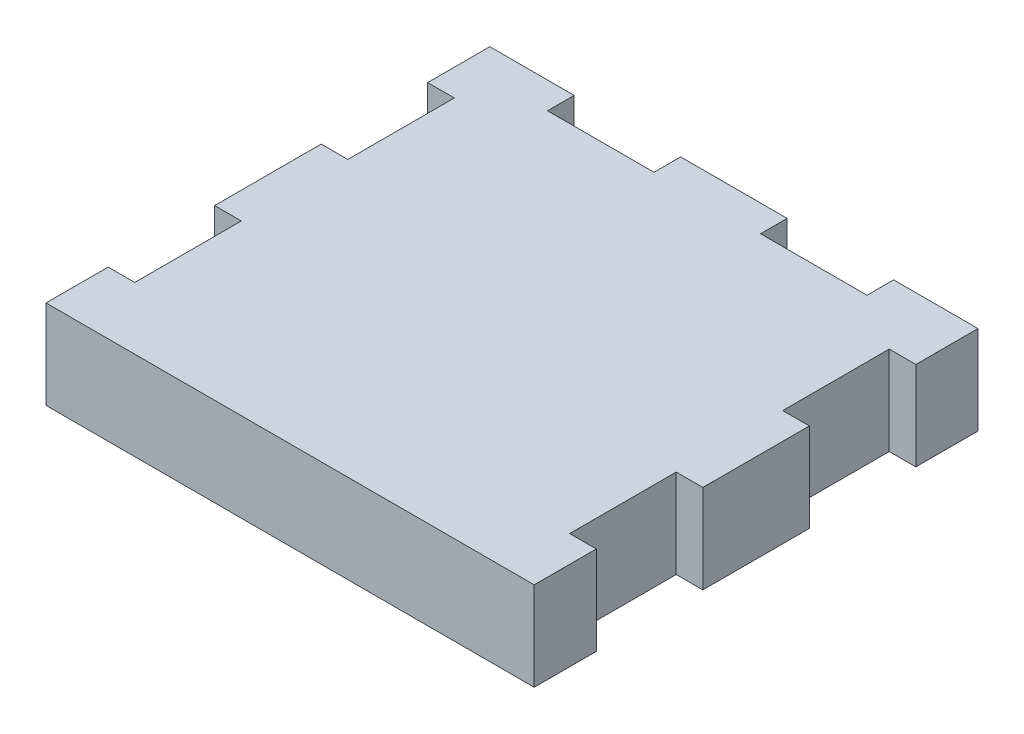
ISO-10303-21;
HEADER;
FILE_DESCRIPTION(('STEP AP214'),'2;1');
FILE_NAME('part.step','',(''),(''),'','','');
FILE_SCHEMA(('AUTOMOTIVE_DESIGN { 1 0 10303 214 1 1 1 1 }'));
ENDSEC;
DATA;
#1=APPLICATION_CONTEXT('core data for automotive mechanical design processes');
#2=APPLICATION_PROTOCOL_DEFINITION('international standard','automotive_design',2000,#1);
#3=PRODUCT_CONTEXT('',#1,'mechanical');
#4=PRODUCT('Part','Part','',(#3));
#5=PRODUCT_RELATED_PRODUCT_CATEGORY('part','',(#4));
#6=PRODUCT_DEFINITION_FORMATION('','',#4);
#7=PRODUCT_DEFINITION_CONTEXT('part definition',#1,'design');
#8=PRODUCT_DEFINITION('design','',#6,#7);
#9=PRODUCT_DEFINITION_SHAPE('','',#8);
#10=(LENGTH_UNIT() NAMED_UNIT(*) SI_UNIT(.MILLI.,.METRE.));
#11=(NAMED_UNIT(*) PLANE_ANGLE_UNIT() SI_UNIT($,.RADIAN.));
#12=(NAMED_UNIT(*) SI_UNIT($,.STERADIAN.) SOLID_ANGLE_UNIT());
#13=UNCERTAINTY_MEASURE_WITH_UNIT(LENGTH_MEASURE(1.E-05),#10,'distance_accuracy_value','');
#14=(GEOMETRIC_REPRESENTATION_CONTEXT(3) GLOBAL_UNCERTAINTY_ASSIGNED_CONTEXT((#13)) GLOBAL_UNIT_ASSIGNED_CONTEXT((#10,
#11,#12)) REPRESENTATION_CONTEXT('',''));
#15=CARTESIAN_POINT('',(0.,0.,0.));
#16=DIRECTION('',(0.,0.,1.));
#17=DIRECTION('',(1.,0.,0.));
#18=AXIS2_PLACEMENT_3D('',#15,#16,#17);
#19=CARTESIAN_POINT('',(-135.812908411026,10.,-122.703686356544));
#20=DIRECTION('',(1.,0.,0.));
#21=DIRECTION('',(0.,0.,-1.));
#22=AXIS2_PLACEMENT_3D('',#19,#20,#21);
#23=PLANE('',#22);
#24=DIRECTION('',(0.,0.,1.));
#25=VECTOR('',#24,1.);
#26=CARTESIAN_POINT('',(-135.812908411026,0.,-122.703686356544));
#27=LINE('',#26,#25);
#28=CARTESIAN_POINT('',(-135.812908411026,0.,-125.703692436218));
#29=VERTEX_POINT('',#28);
#30=CARTESIAN_POINT('',(-135.812908411026,0.,-118.703693151474));
#31=VERTEX_POINT('',#30);
#32=EDGE_CURVE('E153',#29,#31,#27,.T.);
#33=ORIENTED_EDGE('',*,*,#32,.T.);
#34=DIRECTION('',(0.,-1.,0.));
#35=VECTOR('',#34,1.);
#36=CARTESIAN_POINT('',(-135.812908411026,10.,-118.703693151474));
#37=LINE('',#36,#35);
#38=CARTESIAN_POINT('',(-135.812908411026,10.,-118.703693151474));
#39=VERTEX_POINT('',#38);
#40=EDGE_CURVE('E11',#39,#31,#37,.T.);
#41=ORIENTED_EDGE('',*,*,#40,.F.);
#42=DIRECTION('',(0.,0.,1.));
#43=VECTOR('',#42,1.);
#44=CARTESIAN_POINT('',(-135.812908411026,10.,-125.703692436218));
#45=LINE('',#44,#43);
#46=CARTESIAN_POINT('',(-135.812908411026,10.,-125.703692436218));
#47=VERTEX_POINT('',#46);
#48=EDGE_CURVE('E159',#47,#39,#45,.T.);
#49=ORIENTED_EDGE('',*,*,#48,.F.);
#50=DIRECTION('',(0.,-1.,0.));
#51=VECTOR('',#50,1.);
#52=CARTESIAN_POINT('',(-135.812908411026,10.,-125.703692436218));
#53=LINE('',#52,#51);
#54=EDGE_CURVE('E253',#47,#29,#53,.T.);
#55=ORIENTED_EDGE('',*,*,#54,.T.);
#56=EDGE_LOOP('',(#33,#41,#49,#55));
#57=FACE_BOUND('',#56,.T.);
#58=ADVANCED_FACE('F41',(#57),#23,.F.);
#59=CARTESIAN_POINT('',(-135.812908411026,10.,-118.703693151474));
#60=DIRECTION('',(0.,0.,-1.));
#61=DIRECTION('',(-1.,0.,0.));
#62=AXIS2_PLACEMENT_3D('',#59,#60,#61);
#63=PLANE('',#62);
#64=DIRECTION('',(1.,0.,0.));
#65=VECTOR('',#64,1.);
#66=CARTESIAN_POINT('',(-135.812908411026,0.,-118.703693151474));
#67=LINE('',#66,#65);
#68=CARTESIAN_POINT('',(-132.812917232513,0.,-118.703693151474));
#69=VERTEX_POINT('',#68);
#70=EDGE_CURVE('E258',#31,#69,#67,.T.);
#71=ORIENTED_EDGE('',*,*,#70,.T.);
#72=DIRECTION('',(0.,-1.,0.));
#73=VECTOR('',#72,1.);
#74=CARTESIAN_POINT('',(-132.812917232513,10.,-118.703693151474));
#75=LINE('',#74,#73);
#76=CARTESIAN_POINT('',(-132.812917232513,10.,-118.703693151474));
#77=VERTEX_POINT('',#76);
#78=EDGE_CURVE('E49',#77,#69,#75,.T.);
#79=ORIENTED_EDGE('',*,*,#78,.F.);
#80=DIRECTION('',(1.,0.,0.));
#81=VECTOR('',#80,1.);
#82=CARTESIAN_POINT('',(-135.812908411026,10.,-118.703693151474));
#83=LINE('',#82,#81);
#84=EDGE_CURVE('E459',#39,#77,#83,.T.);
#85=ORIENTED_EDGE('',*,*,#84,.F.);
#86=ORIENTED_EDGE('',*,*,#40,.T.);
#87=EDGE_LOOP('',(#71,#79,#85,#86));
#88=FACE_BOUND('',#87,.T.);
#89=ADVANCED_FACE('F462',(#88),#63,.F.);
#90=CARTESIAN_POINT('',(-132.812917232513,10.,-118.703693151474));
#91=DIRECTION('',(1.,0.,0.));
#92=DIRECTION('',(0.,0.,-1.));
#93=AXIS2_PLACEMENT_3D('',#90,#91,#92);
#94=PLANE('',#93);
#95=DIRECTION('',(0.,0.,1.));
#96=VECTOR('',#95,1.);
#97=CARTESIAN_POINT('',(-132.812917232513,0.,-118.703693151474));
#98=LINE('',#97,#96);
#99=CARTESIAN_POINT('',(-132.812917232513,0.,-106.703691184521));
#100=VERTEX_POINT('',#99);
#101=EDGE_CURVE('E260',#69,#100,#98,.T.);
#102=ORIENTED_EDGE('',*,*,#101,.T.);
#103=DIRECTION('',(0.,-1.,0.));
#104=VECTOR('',#103,1.);
#105=CARTESIAN_POINT('',(-132.812917232513,10.,-106.703691184521));
#106=LINE('',#105,#104);
#107=CARTESIAN_POINT('',(-132.812917232513,10.,-106.703691184521));
#108=VERTEX_POINT('',#107);
#109=EDGE_CURVE('E378',#108,#100,#106,.T.);
#110=ORIENTED_EDGE('',*,*,#109,.F.);
#111=DIRECTION('',(0.,0.,1.));
#112=VECTOR('',#111,1.);
#113=CARTESIAN_POINT('',(-132.812917232513,10.,-118.703693151474));
#114=LINE('',#113,#112);
#115=EDGE_CURVE('E387',#77,#108,#114,.T.);
#116=ORIENTED_EDGE('',*,*,#115,.F.);
#117=ORIENTED_EDGE('',*,*,#78,.T.);
#118=EDGE_LOOP('',(#102,#110,#116,#117));
#119=FACE_BOUND('',#118,.T.);
#120=ADVANCED_FACE('F385',(#119),#94,.F.);
#121=CARTESIAN_POINT('',(-135.812908411026,10.,-106.703691184521));
#122=DIRECTION('',(0.,0.,1.));
#123=DIRECTION('',(1.,0.,0.));
#124=AXIS2_PLACEMENT_3D('',#121,#122,#123);
#125=PLANE('',#124);
#126=DIRECTION('',(-1.,0.,0.));
#127=VECTOR('',#126,1.);
#128=CARTESIAN_POINT('',(-135.812908411026,0.,-106.703691184521));
#129=LINE('',#128,#127);
#130=CARTESIAN_POINT('',(-135.812908411026,0.,-106.703691184521));
#131=VERTEX_POINT('',#130);
#132=EDGE_CURVE('E262',#100,#131,#129,.T.);
#133=ORIENTED_EDGE('',*,*,#132,.T.);
#134=DIRECTION('',(0.,-1.,0.));
#135=VECTOR('',#134,1.);
#136=CARTESIAN_POINT('',(-135.812908411026,10.,-106.703691184521));
#137=LINE('',#136,#135);
#138=CARTESIAN_POINT('',(-135.812908411026,10.,-106.703691184521));
#139=VERTEX_POINT('',#138);
#140=EDGE_CURVE('E375',#139,#131,#137,.T.);
#141=ORIENTED_EDGE('',*,*,#140,.F.);
#142=DIRECTION('',(-1.,0.,0.));
#143=VECTOR('',#142,1.);
#144=CARTESIAN_POINT('',(-135.812908411026,10.,-106.703691184521));
#145=LINE('',#144,#143);
#146=EDGE_CURVE('E405',#108,#139,#145,.T.);
#147=ORIENTED_EDGE('',*,*,#146,.F.);
#148=ORIENTED_EDGE('',*,*,#109,.T.);
#149=EDGE_LOOP('',(#133,#141,#147,#148));
#150=FACE_BOUND('',#149,.T.);
#151=ADVANCED_FACE('F396',(#150),#125,.F.);
#152=CARTESIAN_POINT('',(-135.812908411026,10.,-106.703691184521));
#153=DIRECTION('',(1.,0.,0.));
#154=DIRECTION('',(0.,0.,-1.));
#155=AXIS2_PLACEMENT_3D('',#152,#153,#154);
#156=PLANE('',#155);
#157=DIRECTION('',(0.,0.,1.));
#158=VECTOR('',#157,1.);
#159=CARTESIAN_POINT('',(-135.812908411026,0.,-106.703691184521));
#160=LINE('',#159,#158);
#161=CARTESIAN_POINT('',(-135.812908411026,0.,-94.7036892175674));
#162=VERTEX_POINT('',#161);
#163=EDGE_CURVE('E264',#131,#162,#160,.T.);
#164=ORIENTED_EDGE('',*,*,#163,.T.);
#165=DIRECTION('',(0.,-1.,0.));
#166=VECTOR('',#165,1.);
#167=CARTESIAN_POINT('',(-135.812908411026,10.,-94.7036892175674));
#168=LINE('',#167,#166);
#169=CARTESIAN_POINT('',(-135.812908411026,10.,-94.7036892175674));
#170=VERTEX_POINT('',#169);
#171=EDGE_CURVE('E372',#170,#162,#168,.T.);
#172=ORIENTED_EDGE('',*,*,#171,.F.);
#173=DIRECTION('',(0.,0.,1.));
#174=VECTOR('',#173,1.);
#175=CARTESIAN_POINT('',(-135.812908411026,10.,-106.703691184521));
#176=LINE('',#175,#174);
#177=EDGE_CURVE('E402',#139,#170,#176,.T.);
#178=ORIENTED_EDGE('',*,*,#177,.F.);
#179=ORIENTED_EDGE('',*,*,#140,.T.);
#180=EDGE_LOOP('',(#164,#172,#178,#179));
#181=FACE_BOUND('',#180,.T.);
#182=ADVANCED_FACE('F400',(#181),#156,.F.);
#183=CARTESIAN_POINT('',(-135.812908411026,10.,-94.7036892175674));
#184=DIRECTION('',(0.,0.,-1.));
#185=DIRECTION('',(-1.,0.,0.));
#186=AXIS2_PLACEMENT_3D('',#183,#184,#185);
#187=PLANE('',#186);
#188=DIRECTION('',(1.,0.,0.));
#189=VECTOR('',#188,1.);
#190=CARTESIAN_POINT('',(-135.812908411026,0.,-94.7036892175674));
#191=LINE('',#190,#189);
#192=CARTESIAN_POINT('',(-132.812917232513,0.,-94.7036892175674));
#193=VERTEX_POINT('',#192);
#194=EDGE_CURVE('E266',#162,#193,#191,.T.);
#195=ORIENTED_EDGE('',*,*,#194,.T.);
#196=DIRECTION('',(0.,-1.,0.));
#197=VECTOR('',#196,1.);
#198=CARTESIAN_POINT('',(-132.812917232513,10.,-94.7036892175674));
#199=LINE('',#198,#197);
#200=CARTESIAN_POINT('',(-132.812917232513,10.,-94.7036892175674));
#201=VERTEX_POINT('',#200);
#202=EDGE_CURVE('E369',#201,#193,#199,.T.);
#203=ORIENTED_EDGE('',*,*,#202,.F.);
#204=DIRECTION('',(1.,0.,0.));
#205=VECTOR('',#204,1.);
#206=CARTESIAN_POINT('',(-135.812908411026,10.,-94.7036892175674));
#207=LINE('',#206,#205);
#208=EDGE_CURVE('E404',#170,#201,#207,.T.);
#209=ORIENTED_EDGE('',*,*,#208,.F.);
#210=ORIENTED_EDGE('',*,*,#171,.T.);
#211=EDGE_LOOP('',(#195,#203,#209,#210));
#212=FACE_BOUND('',#211,.T.);
#213=ADVANCED_FACE('F474',(#212),#187,.F.);
#214=CARTESIAN_POINT('',(-132.812917232513,10.,-94.7036892175674));
#215=DIRECTION('',(1.,0.,0.));
#216=DIRECTION('',(0.,0.,-1.));
#217=AXIS2_PLACEMENT_3D('',#214,#215,#216);
#218=PLANE('',#217);
#219=DIRECTION('',(0.,0.,1.));
#220=VECTOR('',#219,1.);
#221=CARTESIAN_POINT('',(-132.812917232513,0.,-94.7036892175674));
#222=LINE('',#221,#220);
#223=CARTESIAN_POINT('',(-132.812917232513,0.,-82.7036872506142));
#224=VERTEX_POINT('',#223);
#225=EDGE_CURVE('E268',#193,#224,#222,.T.);
#226=ORIENTED_EDGE('',*,*,#225,.T.);
#227=DIRECTION('',(0.,-1.,0.));
#228=VECTOR('',#227,1.);
#229=CARTESIAN_POINT('',(-132.812917232513,10.,-82.7036872506142));
#230=LINE('',#229,#228);
#231=CARTESIAN_POINT('',(-132.812917232513,10.,-82.7036872506142));
#232=VERTEX_POINT('',#231);
#233=EDGE_CURVE('E366',#232,#224,#230,.T.);
#234=ORIENTED_EDGE('',*,*,#233,.F.);
#235=DIRECTION('',(0.,0.,1.));
#236=VECTOR('',#235,1.);
#237=CARTESIAN_POINT('',(-132.812917232513,10.,-94.7036892175674));
#238=LINE('',#237,#236);
#239=EDGE_CURVE('E407',#201,#232,#238,.T.);
#240=ORIENTED_EDGE('',*,*,#239,.F.);
#241=ORIENTED_EDGE('',*,*,#202,.T.);
#242=EDGE_LOOP('',(#226,#234,#240,#241));
#243=FACE_BOUND('',#242,.T.);
#244=ADVANCED_FACE('F477',(#243),#218,.F.);
#245=CARTESIAN_POINT('',(-135.812908411026,10.,-82.7036872506142));
#246=DIRECTION('',(0.,0.,1.));
#247=DIRECTION('',(1.,0.,0.));
#248=AXIS2_PLACEMENT_3D('',#245,#246,#247);
#249=PLANE('',#248);
#250=DIRECTION('',(-1.,0.,0.));
#251=VECTOR('',#250,1.);
#252=CARTESIAN_POINT('',(-135.812908411026,0.,-82.7036872506142));
#253=LINE('',#252,#251);
#254=CARTESIAN_POINT('',(-135.812908411026,0.,-82.7036872506142));
#255=VERTEX_POINT('',#254);
#256=EDGE_CURVE('E270',#224,#255,#253,.T.);
#257=ORIENTED_EDGE('',*,*,#256,.T.);
#258=DIRECTION('',(0.,-1.,0.));
#259=VECTOR('',#258,1.);
#260=CARTESIAN_POINT('',(-135.812908411026,10.,-82.7036872506142));
#261=LINE('',#260,#259);
#262=CARTESIAN_POINT('',(-135.812908411026,10.,-82.7036872506142));
#263=VERTEX_POINT('',#262);
#264=EDGE_CURVE('E363',#263,#255,#261,.T.);
#265=ORIENTED_EDGE('',*,*,#264,.F.);
#266=DIRECTION('',(-1.,0.,0.));
#267=VECTOR('',#266,1.);
#268=CARTESIAN_POINT('',(-135.812908411026,10.,-82.7036872506142));
#269=LINE('',#268,#267);
#270=EDGE_CURVE('E413',#232,#263,#269,.T.);
#271=ORIENTED_EDGE('',*,*,#270,.F.);
#272=ORIENTED_EDGE('',*,*,#233,.T.);
#273=EDGE_LOOP('',(#257,#265,#271,#272));
#274=FACE_BOUND('',#273,.T.);
#275=ADVANCED_FACE('F481',(#274),#249,.F.);
#276=CARTESIAN_POINT('',(-135.812908411026,10.,-82.7036872506142));
#277=DIRECTION('',(1.,0.,0.));
#278=DIRECTION('',(0.,0.,-1.));
#279=AXIS2_PLACEMENT_3D('',#276,#277,#278);
#280=PLANE('',#279);
#281=DIRECTION('',(0.,0.,1.));
#282=VECTOR('',#281,1.);
#283=CARTESIAN_POINT('',(-135.812908411026,0.,-82.7036872506142));
#284=LINE('',#283,#282);
#285=CARTESIAN_POINT('',(-135.812908411026,0.,-75.7036879658699));
#286=VERTEX_POINT('',#285);
#287=EDGE_CURVE('E272',#255,#286,#284,.T.);
#288=ORIENTED_EDGE('',*,*,#287,.T.);
#289=DIRECTION('',(0.,-1.,0.));
#290=VECTOR('',#289,1.);
#291=CARTESIAN_POINT('',(-135.812908411026,10.,-75.7036879658699));
#292=LINE('',#291,#290);
#293=CARTESIAN_POINT('',(-135.812908411026,10.,-75.7036879658699));
#294=VERTEX_POINT('',#293);
#295=EDGE_CURVE('E360',#294,#286,#292,.T.);
#296=ORIENTED_EDGE('',*,*,#295,.F.);
#297=DIRECTION('',(0.,0.,1.));
#298=VECTOR('',#297,1.);
#299=CARTESIAN_POINT('',(-135.812908411026,10.,-82.7036872506142));
#300=LINE('',#299,#298);
#301=EDGE_CURVE('E415',#263,#294,#300,.T.);
#302=ORIENTED_EDGE('',*,*,#301,.F.);
#303=ORIENTED_EDGE('',*,*,#264,.T.);
#304=EDGE_LOOP('',(#288,#296,#302,#303));
#305=FACE_BOUND('',#304,.T.);
#306=ADVANCED_FACE('F485',(#305),#280,.F.);
#307=CARTESIAN_POINT('',(-135.812908411026,10.,-75.7036879658699));
#308=DIRECTION('',(0.,0.,-1.));
#309=DIRECTION('',(-1.,0.,0.));
#310=AXIS2_PLACEMENT_3D('',#307,#308,#309);
#311=PLANE('',#310);
#312=DIRECTION('',(1.,0.,0.));
#313=VECTOR('',#312,1.);
#314=CARTESIAN_POINT('',(-135.812908411026,0.,-75.7036879658699));
#315=LINE('',#314,#313);
#316=CARTESIAN_POINT('',(-80.8129087090492,0.,-75.7036879658699));
#317=VERTEX_POINT('',#316);
#318=EDGE_CURVE('E274',#286,#317,#315,.T.);
#319=ORIENTED_EDGE('',*,*,#318,.T.);
#320=DIRECTION('',(0.,-1.,0.));
#321=VECTOR('',#320,1.);
#322=CARTESIAN_POINT('',(-80.8129087090492,10.,-75.7036879658699));
#323=LINE('',#322,#321);
#324=CARTESIAN_POINT('',(-80.8129087090492,10.,-75.7036879658699));
#325=VERTEX_POINT('',#324);
#326=EDGE_CURVE('E357',#325,#317,#323,.T.);
#327=ORIENTED_EDGE('',*,*,#326,.F.);
#328=DIRECTION('',(1.,0.,0.));
#329=VECTOR('',#328,1.);
#330=CARTESIAN_POINT('',(-135.812908411026,10.,-75.7036879658699));
#331=LINE('',#330,#329);
#332=EDGE_CURVE('E417',#294,#325,#331,.T.);
#333=ORIENTED_EDGE('',*,*,#332,.F.);
#334=ORIENTED_EDGE('',*,*,#295,.T.);
#335=EDGE_LOOP('',(#319,#327,#333,#334));
#336=FACE_BOUND('',#335,.T.);
#337=ADVANCED_FACE('F489',(#336),#311,.F.);
#338=CARTESIAN_POINT('',(-80.8129087090492,10.,-82.7036872506142));
#339=DIRECTION('',(-1.,0.,0.));
#340=DIRECTION('',(0.,0.,1.));
#341=AXIS2_PLACEMENT_3D('',#338,#339,#340);
#342=PLANE('',#341);
#343=DIRECTION('',(0.,0.,-1.));
#344=VECTOR('',#343,1.);
#345=CARTESIAN_POINT('',(-80.8129087090492,0.,-82.7036872506142));
#346=LINE('',#345,#344);
#347=CARTESIAN_POINT('',(-80.8129087090492,0.,-82.7036872506142));
#348=VERTEX_POINT('',#347);
#349=EDGE_CURVE('E276',#317,#348,#346,.T.);
#350=ORIENTED_EDGE('',*,*,#349,.T.);
#351=DIRECTION('',(0.,-1.,0.));
#352=VECTOR('',#351,1.);
#353=CARTESIAN_POINT('',(-80.8129087090492,10.,-82.7036872506142));
#354=LINE('',#353,#352);
#355=CARTESIAN_POINT('',(-80.8129087090492,10.,-82.7036872506142));
#356=VERTEX_POINT('',#355);
#357=EDGE_CURVE('E354',#356,#348,#354,.T.);
#358=ORIENTED_EDGE('',*,*,#357,.F.);
#359=DIRECTION('',(0.,0.,-1.));
#360=VECTOR('',#359,1.);
#361=CARTESIAN_POINT('',(-80.8129087090492,10.,-82.7036872506142));
#362=LINE('',#361,#360);
#363=EDGE_CURVE('E419',#325,#356,#362,.T.);
#364=ORIENTED_EDGE('',*,*,#363,.F.);
#365=ORIENTED_EDGE('',*,*,#326,.T.);
#366=EDGE_LOOP('',(#350,#358,#364,#365));
#367=FACE_BOUND('',#366,.T.);
#368=ADVANCED_FACE('F493',(#367),#342,.F.);
#369=CARTESIAN_POINT('',(-83.812914788723,10.,-82.7036872506142));
#370=DIRECTION('',(0.,0.,1.));
#371=DIRECTION('',(1.,0.,0.));
#372=AXIS2_PLACEMENT_3D('',#369,#370,#371);
#373=PLANE('',#372);
#374=DIRECTION('',(-1.,0.,0.));
#375=VECTOR('',#374,1.);
#376=CARTESIAN_POINT('',(-83.812914788723,0.,-82.7036872506142));
#377=LINE('',#376,#375);
#378=CARTESIAN_POINT('',(-83.812914788723,0.,-82.7036872506142));
#379=VERTEX_POINT('',#378);
#380=EDGE_CURVE('E278',#348,#379,#377,.T.);
#381=ORIENTED_EDGE('',*,*,#380,.T.);
#382=DIRECTION('',(0.,-1.,0.));
#383=VECTOR('',#382,1.);
#384=CARTESIAN_POINT('',(-83.812914788723,10.,-82.7036872506142));
#385=LINE('',#384,#383);
#386=CARTESIAN_POINT('',(-83.812914788723,10.,-82.7036872506142));
#387=VERTEX_POINT('',#386);
#388=EDGE_CURVE('E351',#387,#379,#385,.T.);
#389=ORIENTED_EDGE('',*,*,#388,.F.);
#390=DIRECTION('',(-1.,0.,0.));
#391=VECTOR('',#390,1.);
#392=CARTESIAN_POINT('',(-83.812914788723,10.,-82.7036872506142));
#393=LINE('',#392,#391);
#394=EDGE_CURVE('E421',#356,#387,#393,.T.);
#395=ORIENTED_EDGE('',*,*,#394,.F.);
#396=ORIENTED_EDGE('',*,*,#357,.T.);
#397=EDGE_LOOP('',(#381,#389,#395,#396));
#398=FACE_BOUND('',#397,.T.);
#399=ADVANCED_FACE('F497',(#398),#373,.F.);
#400=CARTESIAN_POINT('',(-83.812914788723,10.,-94.7036892175674));
#401=DIRECTION('',(-1.,0.,0.));
#402=DIRECTION('',(0.,0.,1.));
#403=AXIS2_PLACEMENT_3D('',#400,#401,#402);
#404=PLANE('',#403);
#405=DIRECTION('',(0.,0.,-1.));
#406=VECTOR('',#405,1.);
#407=CARTESIAN_POINT('',(-83.812914788723,0.,-94.7036892175674));
#408=LINE('',#407,#406);
#409=CARTESIAN_POINT('',(-83.812914788723,0.,-94.7036892175674));
#410=VERTEX_POINT('',#409);
#411=EDGE_CURVE('E280',#379,#410,#408,.T.);
#412=ORIENTED_EDGE('',*,*,#411,.T.);
#413=DIRECTION('',(0.,-1.,0.));
#414=VECTOR('',#413,1.);
#415=CARTESIAN_POINT('',(-83.812914788723,10.,-94.7036892175674));
#416=LINE('',#415,#414);
#417=CARTESIAN_POINT('',(-83.812914788723,10.,-94.7036892175674));
#418=VERTEX_POINT('',#417);
#419=EDGE_CURVE('E348',#418,#410,#416,.T.);
#420=ORIENTED_EDGE('',*,*,#419,.F.);
#421=DIRECTION('',(0.,0.,-1.));
#422=VECTOR('',#421,1.);
#423=CARTESIAN_POINT('',(-83.812914788723,10.,-94.7036892175674));
#424=LINE('',#423,#422);
#425=EDGE_CURVE('E423',#387,#418,#424,.T.);
#426=ORIENTED_EDGE('',*,*,#425,.F.);
#427=ORIENTED_EDGE('',*,*,#388,.T.);
#428=EDGE_LOOP('',(#412,#420,#426,#427));
#429=FACE_BOUND('',#428,.T.);
#430=ADVANCED_FACE('F501',(#429),#404,.F.);
#431=CARTESIAN_POINT('',(-83.812914788723,10.,-94.7036892175674));
#432=DIRECTION('',(0.,0.,-1.));
#433=DIRECTION('',(-1.,0.,0.));
#434=AXIS2_PLACEMENT_3D('',#431,#432,#433);
#435=PLANE('',#434);
#436=DIRECTION('',(1.,0.,0.));
#437=VECTOR('',#436,1.);
#438=CARTESIAN_POINT('',(-83.812914788723,0.,-94.7036892175674));
#439=LINE('',#438,#437);
#440=CARTESIAN_POINT('',(-80.8129087090492,0.,-94.7036892175674));
#441=VERTEX_POINT('',#440);
#442=EDGE_CURVE('E282',#410,#441,#439,.T.);
#443=ORIENTED_EDGE('',*,*,#442,.T.);
#444=DIRECTION('',(0.,-1.,0.));
#445=VECTOR('',#444,1.);
#446=CARTESIAN_POINT('',(-80.8129087090492,10.,-94.7036892175674));
#447=LINE('',#446,#445);
#448=CARTESIAN_POINT('',(-80.8129087090492,10.,-94.7036892175674));
#449=VERTEX_POINT('',#448);
#450=EDGE_CURVE('E345',#449,#441,#447,.T.);
#451=ORIENTED_EDGE('',*,*,#450,.F.);
#452=DIRECTION('',(1.,0.,0.));
#453=VECTOR('',#452,1.);
#454=CARTESIAN_POINT('',(-83.812914788723,10.,-94.7036892175674));
#455=LINE('',#454,#453);
#456=EDGE_CURVE('E425',#418,#449,#455,.T.);
#457=ORIENTED_EDGE('',*,*,#456,.F.);
#458=ORIENTED_EDGE('',*,*,#419,.T.);
#459=EDGE_LOOP('',(#443,#451,#457,#458));
#460=FACE_BOUND('',#459,.T.);
#461=ADVANCED_FACE('F505',(#460),#435,.F.);
#462=CARTESIAN_POINT('',(-80.8129087090492,10.,-106.703691184521));
#463=DIRECTION('',(-1.,0.,0.));
#464=DIRECTION('',(0.,0.,1.));
#465=AXIS2_PLACEMENT_3D('',#462,#463,#464);
#466=PLANE('',#465);
#467=DIRECTION('',(0.,0.,-1.));
#468=VECTOR('',#467,1.);
#469=CARTESIAN_POINT('',(-80.8129087090492,0.,-106.703691184521));
#470=LINE('',#469,#468);
#471=CARTESIAN_POINT('',(-80.8129087090492,0.,-106.703691184521));
#472=VERTEX_POINT('',#471);
#473=EDGE_CURVE('E284',#441,#472,#470,.T.);
#474=ORIENTED_EDGE('',*,*,#473,.T.);
#475=DIRECTION('',(0.,-1.,0.));
#476=VECTOR('',#475,1.);
#477=CARTESIAN_POINT('',(-80.8129087090492,10.,-106.703691184521));
#478=LINE('',#477,#476);
#479=CARTESIAN_POINT('',(-80.8129087090492,10.,-106.703691184521));
#480=VERTEX_POINT('',#479);
#481=EDGE_CURVE('E342',#480,#472,#478,.T.);
#482=ORIENTED_EDGE('',*,*,#481,.F.);
#483=DIRECTION('',(0.,0.,-1.));
#484=VECTOR('',#483,1.);
#485=CARTESIAN_POINT('',(-80.8129087090492,10.,-106.703691184521));
#486=LINE('',#485,#484);
#487=EDGE_CURVE('E427',#449,#480,#486,.T.);
#488=ORIENTED_EDGE('',*,*,#487,.F.);
#489=ORIENTED_EDGE('',*,*,#450,.T.);
#490=EDGE_LOOP('',(#474,#482,#488,#489));
#491=FACE_BOUND('',#490,.T.);
#492=ADVANCED_FACE('F509',(#491),#466,.F.);
#493=CARTESIAN_POINT('',(-83.812914788723,10.,-106.703691184521));
#494=DIRECTION('',(0.,0.,1.));
#495=DIRECTION('',(1.,0.,0.));
#496=AXIS2_PLACEMENT_3D('',#493,#494,#495);
#497=PLANE('',#496);
#498=DIRECTION('',(-1.,0.,0.));
#499=VECTOR('',#498,1.);
#500=CARTESIAN_POINT('',(-83.812914788723,0.,-106.703691184521));
#501=LINE('',#500,#499);
#502=CARTESIAN_POINT('',(-83.812914788723,0.,-106.703691184521));
#503=VERTEX_POINT('',#502);
#504=EDGE_CURVE('E286',#472,#503,#501,.T.);
#505=ORIENTED_EDGE('',*,*,#504,.T.);
#506=DIRECTION('',(0.,-1.,0.));
#507=VECTOR('',#506,1.);
#508=CARTESIAN_POINT('',(-83.812914788723,10.,-106.703691184521));
#509=LINE('',#508,#507);
#510=CARTESIAN_POINT('',(-83.812914788723,10.,-106.703691184521));
#511=VERTEX_POINT('',#510);
#512=EDGE_CURVE('E339',#511,#503,#509,.T.);
#513=ORIENTED_EDGE('',*,*,#512,.F.);
#514=DIRECTION('',(-1.,0.,0.));
#515=VECTOR('',#514,1.);
#516=CARTESIAN_POINT('',(-83.812914788723,10.,-106.703691184521));
#517=LINE('',#516,#515);
#518=EDGE_CURVE('E429',#480,#511,#517,.T.);
#519=ORIENTED_EDGE('',*,*,#518,.F.);
#520=ORIENTED_EDGE('',*,*,#481,.T.);
#521=EDGE_LOOP('',(#505,#513,#519,#520));
#522=FACE_BOUND('',#521,.T.);
#523=ADVANCED_FACE('F513',(#522),#497,.F.);
#524=CARTESIAN_POINT('',(-83.812914788723,10.,-118.703693151474));
#525=DIRECTION('',(-1.,0.,0.));
#526=DIRECTION('',(0.,0.,1.));
#527=AXIS2_PLACEMENT_3D('',#524,#525,#526);
#528=PLANE('',#527);
#529=DIRECTION('',(0.,0.,-1.));
#530=VECTOR('',#529,1.);
#531=CARTESIAN_POINT('',(-83.812914788723,0.,-118.703693151474));
#532=LINE('',#531,#530);
#533=CARTESIAN_POINT('',(-83.812914788723,0.,-118.703693151474));
#534=VERTEX_POINT('',#533);
#535=EDGE_CURVE('E288',#503,#534,#532,.T.);
#536=ORIENTED_EDGE('',*,*,#535,.T.);
#537=DIRECTION('',(0.,-1.,0.));
#538=VECTOR('',#537,1.);
#539=CARTESIAN_POINT('',(-83.812914788723,10.,-118.703693151474));
#540=LINE('',#539,#538);
#541=CARTESIAN_POINT('',(-83.812914788723,10.,-118.703693151474));
#542=VERTEX_POINT('',#541);
#543=EDGE_CURVE('E336',#542,#534,#540,.T.);
#544=ORIENTED_EDGE('',*,*,#543,.F.);
#545=DIRECTION('',(0.,0.,-1.));
#546=VECTOR('',#545,1.);
#547=CARTESIAN_POINT('',(-83.812914788723,10.,-118.703693151474));
#548=LINE('',#547,#546);
#549=EDGE_CURVE('E431',#511,#542,#548,.T.);
#550=ORIENTED_EDGE('',*,*,#549,.F.);
#551=ORIENTED_EDGE('',*,*,#512,.T.);
#552=EDGE_LOOP('',(#536,#544,#550,#551));
#553=FACE_BOUND('',#552,.T.);
#554=ADVANCED_FACE('F517',(#553),#528,.F.);
#555=CARTESIAN_POINT('',(-83.812914788723,10.,-118.703693151474));
#556=DIRECTION('',(0.,0.,-1.));
#557=DIRECTION('',(-1.,0.,0.));
#558=AXIS2_PLACEMENT_3D('',#555,#556,#557);
#559=PLANE('',#558);
#560=DIRECTION('',(1.,0.,0.));
#561=VECTOR('',#560,1.);
#562=CARTESIAN_POINT('',(-83.812914788723,0.,-118.703693151474));
#563=LINE('',#562,#561);
#564=CARTESIAN_POINT('',(-80.8129087090492,0.,-118.703693151474));
#565=VERTEX_POINT('',#564);
#566=EDGE_CURVE('E290',#534,#565,#563,.T.);
#567=ORIENTED_EDGE('',*,*,#566,.T.);
#568=DIRECTION('',(0.,-1.,0.));
#569=VECTOR('',#568,1.);
#570=CARTESIAN_POINT('',(-80.8129087090492,10.,-118.703693151474));
#571=LINE('',#570,#569);
#572=CARTESIAN_POINT('',(-80.8129087090492,10.,-118.703693151474));
#573=VERTEX_POINT('',#572);
#574=EDGE_CURVE('E333',#573,#565,#571,.T.);
#575=ORIENTED_EDGE('',*,*,#574,.F.);
#576=DIRECTION('',(1.,0.,0.));
#577=VECTOR('',#576,1.);
#578=CARTESIAN_POINT('',(-83.812914788723,10.,-118.703693151474));
#579=LINE('',#578,#577);
#580=EDGE_CURVE('E433',#542,#573,#579,.T.);
#581=ORIENTED_EDGE('',*,*,#580,.F.);
#582=ORIENTED_EDGE('',*,*,#543,.T.);
#583=EDGE_LOOP('',(#567,#575,#581,#582));
#584=FACE_BOUND('',#583,.T.);
#585=ADVANCED_FACE('F521',(#584),#559,.F.);
#586=CARTESIAN_POINT('',(-80.8129087090492,10.,-125.703692436218));
#587=DIRECTION('',(-1.,0.,0.));
#588=DIRECTION('',(0.,0.,1.));
#589=AXIS2_PLACEMENT_3D('',#586,#587,#588);
#590=PLANE('',#589);
#591=DIRECTION('',(0.,0.,-1.));
#592=VECTOR('',#591,1.);
#593=CARTESIAN_POINT('',(-80.8129087090492,0.,-125.703692436218));
#594=LINE('',#593,#592);
#595=CARTESIAN_POINT('',(-80.8129087090492,0.,-125.703692436218));
#596=VERTEX_POINT('',#595);
#597=EDGE_CURVE('E293',#565,#596,#594,.T.);
#598=ORIENTED_EDGE('',*,*,#597,.T.);
#599=DIRECTION('',(0.,-1.,0.));
#600=VECTOR('',#599,1.);
#601=CARTESIAN_POINT('',(-80.8129087090492,10.,-125.703692436218));
#602=LINE('',#601,#600);
#603=CARTESIAN_POINT('',(-80.8129087090492,10.,-125.703692436218));
#604=VERTEX_POINT('',#603);
#605=EDGE_CURVE('E330',#604,#596,#602,.T.);
#606=ORIENTED_EDGE('',*,*,#605,.F.);
#607=DIRECTION('',(0.,0.,-1.));
#608=VECTOR('',#607,1.);
#609=CARTESIAN_POINT('',(-80.8129087090492,10.,-122.703686356544));
#610=LINE('',#609,#608);
#611=EDGE_CURVE('E435',#573,#604,#610,.T.);
#612=ORIENTED_EDGE('',*,*,#611,.F.);
#613=ORIENTED_EDGE('',*,*,#574,.T.);
#614=EDGE_LOOP('',(#598,#606,#612,#613));
#615=FACE_BOUND('',#614,.T.);
#616=ADVANCED_FACE('F525',(#615),#590,.F.);
#617=CARTESIAN_POINT('',(-90.3129130601883,10.,-125.703692436218));
#618=DIRECTION('',(0.,0.,1.));
#619=DIRECTION('',(1.,0.,0.));
#620=AXIS2_PLACEMENT_3D('',#617,#618,#619);
#621=PLANE('',#620);
#622=DIRECTION('',(-1.,0.,0.));
#623=VECTOR('',#622,1.);
#624=CARTESIAN_POINT('',(-90.3129130601883,0.,-125.703692436218));
#625=LINE('',#624,#623);
#626=CARTESIAN_POINT('',(-90.3129130601883,0.,-125.703692436218));
#627=VERTEX_POINT('',#626);
#628=EDGE_CURVE('E295',#596,#627,#625,.T.);
#629=ORIENTED_EDGE('',*,*,#628,.T.);
#630=DIRECTION('',(0.,-1.,0.));
#631=VECTOR('',#630,1.);
#632=CARTESIAN_POINT('',(-90.3129130601883,10.,-125.703692436218));
#633=LINE('',#632,#631);
#634=CARTESIAN_POINT('',(-90.3129130601883,10.,-125.703692436218));
#635=VERTEX_POINT('',#634);
#636=EDGE_CURVE('E327',#635,#627,#633,.T.);
#637=ORIENTED_EDGE('',*,*,#636,.F.);
#638=DIRECTION('',(-1.,0.,0.));
#639=VECTOR('',#638,1.);
#640=CARTESIAN_POINT('',(-90.3129130601883,10.,-125.703692436218));
#641=LINE('',#640,#639);
#642=EDGE_CURVE('E437',#604,#635,#641,.T.);
#643=ORIENTED_EDGE('',*,*,#642,.F.);
#644=ORIENTED_EDGE('',*,*,#605,.T.);
#645=EDGE_LOOP('',(#629,#637,#643,#644));
#646=FACE_BOUND('',#645,.T.);
#647=ADVANCED_FACE('F529',(#646),#621,.F.);
#648=CARTESIAN_POINT('',(-90.3129130601883,10.,-125.703692436218));
#649=DIRECTION('',(1.,0.,0.));
#650=DIRECTION('',(0.,0.,-1.));
#651=AXIS2_PLACEMENT_3D('',#648,#649,#650);
#652=PLANE('',#651);
#653=DIRECTION('',(0.,0.,1.));
#654=VECTOR('',#653,1.);
#655=CARTESIAN_POINT('',(-90.3129130601883,0.,-125.703692436218));
#656=LINE('',#655,#654);
#657=CARTESIAN_POINT('',(-90.3129130601883,0.,-122.703686356544));
#658=VERTEX_POINT('',#657);
#659=EDGE_CURVE('E297',#627,#658,#656,.T.);
#660=ORIENTED_EDGE('',*,*,#659,.T.);
#661=DIRECTION('',(0.,-1.,0.));
#662=VECTOR('',#661,1.);
#663=CARTESIAN_POINT('',(-90.3129130601883,10.,-122.703686356544));
#664=LINE('',#663,#662);
#665=CARTESIAN_POINT('',(-90.3129130601883,10.,-122.703686356544));
#666=VERTEX_POINT('',#665);
#667=EDGE_CURVE('E324',#666,#658,#664,.T.);
#668=ORIENTED_EDGE('',*,*,#667,.F.);
#669=DIRECTION('',(0.,0.,1.));
#670=VECTOR('',#669,1.);
#671=CARTESIAN_POINT('',(-90.3129130601883,10.,-125.703692436218));
#672=LINE('',#671,#670);
#673=EDGE_CURVE('E439',#635,#666,#672,.T.);
#674=ORIENTED_EDGE('',*,*,#673,.F.);
#675=ORIENTED_EDGE('',*,*,#636,.T.);
#676=EDGE_LOOP('',(#660,#668,#674,#675));
#677=FACE_BOUND('',#676,.T.);
#678=ADVANCED_FACE('F533',(#677),#652,.F.);
#679=CARTESIAN_POINT('',(-102.312915027142,10.,-122.703686356544));
#680=DIRECTION('',(0.,0.,1.));
#681=DIRECTION('',(1.,0.,0.));
#682=AXIS2_PLACEMENT_3D('',#679,#680,#681);
#683=PLANE('',#682);
#684=DIRECTION('',(-1.,0.,0.));
#685=VECTOR('',#684,1.);
#686=CARTESIAN_POINT('',(-102.312915027142,0.,-122.703686356544));
#687=LINE('',#686,#685);
#688=CARTESIAN_POINT('',(-102.312915027142,0.,-122.703686356544));
#689=VERTEX_POINT('',#688);
#690=EDGE_CURVE('E299',#658,#689,#687,.T.);
#691=ORIENTED_EDGE('',*,*,#690,.T.);
#692=DIRECTION('',(0.,-1.,0.));
#693=VECTOR('',#692,1.);
#694=CARTESIAN_POINT('',(-102.312915027142,10.,-122.703686356544));
#695=LINE('',#694,#693);
#696=CARTESIAN_POINT('',(-102.312915027142,10.,-122.703686356544));
#697=VERTEX_POINT('',#696);
#698=EDGE_CURVE('E321',#697,#689,#695,.T.);
#699=ORIENTED_EDGE('',*,*,#698,.F.);
#700=DIRECTION('',(-1.,0.,0.));
#701=VECTOR('',#700,1.);
#702=CARTESIAN_POINT('',(-102.312915027142,10.,-122.703686356544));
#703=LINE('',#702,#701);
#704=EDGE_CURVE('E441',#666,#697,#703,.T.);
#705=ORIENTED_EDGE('',*,*,#704,.F.);
#706=ORIENTED_EDGE('',*,*,#667,.T.);
#707=EDGE_LOOP('',(#691,#699,#705,#706));
#708=FACE_BOUND('',#707,.T.);
#709=ADVANCED_FACE('F537',(#708),#683,.F.);
#710=CARTESIAN_POINT('',(-102.312915027142,10.,-125.703692436218));
#711=DIRECTION('',(-1.,0.,0.));
#712=DIRECTION('',(0.,0.,1.));
#713=AXIS2_PLACEMENT_3D('',#710,#711,#712);
#714=PLANE('',#713);
#715=DIRECTION('',(0.,0.,-1.));
#716=VECTOR('',#715,1.);
#717=CARTESIAN_POINT('',(-102.312915027142,0.,-125.703692436218));
#718=LINE('',#717,#716);
#719=CARTESIAN_POINT('',(-102.312915027142,0.,-125.703692436218));
#720=VERTEX_POINT('',#719);
#721=EDGE_CURVE('E301',#689,#720,#718,.T.);
#722=ORIENTED_EDGE('',*,*,#721,.T.);
#723=DIRECTION('',(0.,-1.,0.));
#724=VECTOR('',#723,1.);
#725=CARTESIAN_POINT('',(-102.312915027142,10.,-125.703692436218));
#726=LINE('',#725,#724);
#727=CARTESIAN_POINT('',(-102.312915027142,10.,-125.703692436218));
#728=VERTEX_POINT('',#727);
#729=EDGE_CURVE('E318',#728,#720,#726,.T.);
#730=ORIENTED_EDGE('',*,*,#729,.F.);
#731=DIRECTION('',(0.,0.,-1.));
#732=VECTOR('',#731,1.);
#733=CARTESIAN_POINT('',(-102.312915027142,10.,-125.703692436218));
#734=LINE('',#733,#732);
#735=EDGE_CURVE('E443',#697,#728,#734,.T.);
#736=ORIENTED_EDGE('',*,*,#735,.F.);
#737=ORIENTED_EDGE('',*,*,#698,.T.);
#738=EDGE_LOOP('',(#722,#730,#736,#737));
#739=FACE_BOUND('',#738,.T.);
#740=ADVANCED_FACE('F541',(#739),#714,.F.);
#741=CARTESIAN_POINT('',(-114.312909543514,10.,-125.703692436218));
#742=DIRECTION('',(0.,0.,1.));
#743=DIRECTION('',(1.,0.,0.));
#744=AXIS2_PLACEMENT_3D('',#741,#742,#743);
#745=PLANE('',#744);
#746=DIRECTION('',(-1.,0.,0.));
#747=VECTOR('',#746,1.);
#748=CARTESIAN_POINT('',(-114.312909543514,0.,-125.703692436218));
#749=LINE('',#748,#747);
#750=CARTESIAN_POINT('',(-114.312909543514,0.,-125.703692436218));
#751=VERTEX_POINT('',#750);
#752=EDGE_CURVE('E303',#720,#751,#749,.T.);
#753=ORIENTED_EDGE('',*,*,#752,.T.);
#754=DIRECTION('',(0.,-1.,0.));
#755=VECTOR('',#754,1.);
#756=CARTESIAN_POINT('',(-114.312909543514,10.,-125.703692436218));
#757=LINE('',#756,#755);
#758=CARTESIAN_POINT('',(-114.312909543514,10.,-125.703692436218));
#759=VERTEX_POINT('',#758);
#760=EDGE_CURVE('E315',#759,#751,#757,.T.);
#761=ORIENTED_EDGE('',*,*,#760,.F.);
#762=DIRECTION('',(-1.,0.,0.));
#763=VECTOR('',#762,1.);
#764=CARTESIAN_POINT('',(-114.312909543514,10.,-125.703692436218));
#765=LINE('',#764,#763);
#766=EDGE_CURVE('E445',#728,#759,#765,.T.);
#767=ORIENTED_EDGE('',*,*,#766,.F.);
#768=ORIENTED_EDGE('',*,*,#729,.T.);
#769=EDGE_LOOP('',(#753,#761,#767,#768));
#770=FACE_BOUND('',#769,.T.);
#771=ADVANCED_FACE('F451',(#770),#745,.F.);
#772=CARTESIAN_POINT('',(-114.312909543514,10.,-125.703692436218));
#773=DIRECTION('',(1.,0.,0.));
#774=DIRECTION('',(0.,0.,-1.));
#775=AXIS2_PLACEMENT_3D('',#772,#773,#774);
#776=PLANE('',#775);
#777=DIRECTION('',(0.,0.,1.));
#778=VECTOR('',#777,1.);
#779=CARTESIAN_POINT('',(-114.312909543514,0.,-125.703692436218));
#780=LINE('',#779,#778);
#781=CARTESIAN_POINT('',(-114.312909543514,0.,-122.703686356544));
#782=VERTEX_POINT('',#781);
#783=EDGE_CURVE('E305',#751,#782,#780,.T.);
#784=ORIENTED_EDGE('',*,*,#783,.T.);
#785=DIRECTION('',(0.,-1.,0.));
#786=VECTOR('',#785,1.);
#787=CARTESIAN_POINT('',(-114.312909543514,10.,-122.703686356544));
#788=LINE('',#787,#786);
#789=CARTESIAN_POINT('',(-114.312909543514,10.,-122.703686356544));
#790=VERTEX_POINT('',#789);
#791=EDGE_CURVE('E248',#790,#782,#788,.T.);
#792=ORIENTED_EDGE('',*,*,#791,.F.);
#793=DIRECTION('',(0.,0.,1.));
#794=VECTOR('',#793,1.);
#795=CARTESIAN_POINT('',(-114.312909543514,10.,-125.703692436218));
#796=LINE('',#795,#794);
#797=EDGE_CURVE('E239',#759,#790,#796,.T.);
#798=ORIENTED_EDGE('',*,*,#797,.F.);
#799=ORIENTED_EDGE('',*,*,#760,.T.);
#800=EDGE_LOOP('',(#784,#792,#798,#799));
#801=FACE_BOUND('',#800,.T.);
#802=ADVANCED_FACE('F455',(#801),#776,.F.);
#803=CARTESIAN_POINT('',(-126.312911510468,10.,-122.703686356544));
#804=DIRECTION('',(0.,0.,1.));
#805=DIRECTION('',(1.,0.,0.));
#806=AXIS2_PLACEMENT_3D('',#803,#804,#805);
#807=PLANE('',#806);
#808=DIRECTION('',(-1.,0.,0.));
#809=VECTOR('',#808,1.);
#810=CARTESIAN_POINT('',(-126.312911510468,0.,-122.703686356544));
#811=LINE('',#810,#809);
#812=CARTESIAN_POINT('',(-126.312911510468,0.,-122.703686356544));
#813=VERTEX_POINT('',#812);
#814=EDGE_CURVE('E247',#782,#813,#811,.T.);
#815=ORIENTED_EDGE('',*,*,#814,.T.);
#816=DIRECTION('',(0.,-1.,0.));
#817=VECTOR('',#816,1.);
#818=CARTESIAN_POINT('',(-126.312911510468,10.,-122.703686356544));
#819=LINE('',#818,#817);
#820=CARTESIAN_POINT('',(-126.312911510468,10.,-122.703686356544));
#821=VERTEX_POINT('',#820);
#822=EDGE_CURVE('E244',#821,#813,#819,.T.);
#823=ORIENTED_EDGE('',*,*,#822,.F.);
#824=DIRECTION('',(-1.,0.,0.));
#825=VECTOR('',#824,1.);
#826=CARTESIAN_POINT('',(-126.312911510468,10.,-122.703686356544));
#827=LINE('',#826,#825);
#828=EDGE_CURVE('E233',#790,#821,#827,.T.);
#829=ORIENTED_EDGE('',*,*,#828,.F.);
#830=ORIENTED_EDGE('',*,*,#791,.T.);
#831=EDGE_LOOP('',(#815,#823,#829,#830));
#832=FACE_BOUND('',#831,.T.);
#833=ADVANCED_FACE('F245',(#832),#807,.F.);
#834=CARTESIAN_POINT('',(-126.312911510468,10.,-125.703692436218));
#835=DIRECTION('',(-1.,0.,0.));
#836=DIRECTION('',(0.,0.,1.));
#837=AXIS2_PLACEMENT_3D('',#834,#835,#836);
#838=PLANE('',#837);
#839=DIRECTION('',(0.,0.,-1.));
#840=VECTOR('',#839,1.);
#841=CARTESIAN_POINT('',(-126.312911510468,0.,-125.703692436218));
#842=LINE('',#841,#840);
#843=CARTESIAN_POINT('',(-126.312911510468,0.,-125.703692436218));
#844=VERTEX_POINT('',#843);
#845=EDGE_CURVE('E146',#813,#844,#842,.T.);
#846=ORIENTED_EDGE('',*,*,#845,.T.);
#847=DIRECTION('',(0.,-1.,0.));
#848=VECTOR('',#847,1.);
#849=CARTESIAN_POINT('',(-126.312911510468,10.,-125.703692436218));
#850=LINE('',#849,#848);
#851=CARTESIAN_POINT('',(-126.312911510468,10.,-125.703692436218));
#852=VERTEX_POINT('',#851);
#853=EDGE_CURVE('E249',#852,#844,#850,.T.);
#854=ORIENTED_EDGE('',*,*,#853,.F.);
#855=DIRECTION('',(0.,0.,-1.));
#856=VECTOR('',#855,1.);
#857=CARTESIAN_POINT('',(-126.312911510468,10.,-125.703692436218));
#858=LINE('',#857,#856);
#859=EDGE_CURVE('E237',#821,#852,#858,.T.);
#860=ORIENTED_EDGE('',*,*,#859,.F.);
#861=ORIENTED_EDGE('',*,*,#822,.T.);
#862=EDGE_LOOP('',(#846,#854,#860,#861));
#863=FACE_BOUND('',#862,.T.);
#864=ADVANCED_FACE('F251',(#863),#838,.F.);
#865=CARTESIAN_POINT('',(-135.812908411026,10.,-125.703692436218));
#866=DIRECTION('',(0.,0.,1.));
#867=DIRECTION('',(1.,0.,0.));
#868=AXIS2_PLACEMENT_3D('',#865,#866,#867);
#869=PLANE('',#868);
#870=DIRECTION('',(-1.,0.,0.));
#871=VECTOR('',#870,1.);
#872=CARTESIAN_POINT('',(-135.812908411026,0.,-125.703692436218));
#873=LINE('',#872,#871);
#874=EDGE_CURVE('E309',#844,#29,#873,.T.);
#875=ORIENTED_EDGE('',*,*,#874,.T.);
#876=ORIENTED_EDGE('',*,*,#54,.F.);
#877=DIRECTION('',(-1.,0.,0.));
#878=VECTOR('',#877,1.);
#879=CARTESIAN_POINT('',(-135.812908411026,10.,-125.703692436218));
#880=LINE('',#879,#878);
#881=EDGE_CURVE('E57',#852,#47,#880,.T.);
#882=ORIENTED_EDGE('',*,*,#881,.F.);
#883=ORIENTED_EDGE('',*,*,#853,.T.);
#884=EDGE_LOOP('',(#875,#876,#882,#883));
#885=FACE_BOUND('',#884,.T.);
#886=ADVANCED_FACE('F457',(#885),#869,.F.);
#887=CARTESIAN_POINT('',(0.,10.,0.));
#888=DIRECTION('',(0.,1.,0.));
#889=DIRECTION('',(0.,0.,1.));
#890=AXIS2_PLACEMENT_3D('',#887,#888,#889);
#891=PLANE('',#890);
#892=ORIENTED_EDGE('',*,*,#48,.T.);
#893=ORIENTED_EDGE('',*,*,#84,.T.);
#894=ORIENTED_EDGE('',*,*,#115,.T.);
#895=ORIENTED_EDGE('',*,*,#146,.T.);
#896=ORIENTED_EDGE('',*,*,#177,.T.);
#897=ORIENTED_EDGE('',*,*,#208,.T.);
#898=ORIENTED_EDGE('',*,*,#239,.T.);
#899=ORIENTED_EDGE('',*,*,#270,.T.);
#900=ORIENTED_EDGE('',*,*,#301,.T.);
#901=ORIENTED_EDGE('',*,*,#332,.T.);
#902=ORIENTED_EDGE('',*,*,#363,.T.);
#903=ORIENTED_EDGE('',*,*,#394,.T.);
#904=ORIENTED_EDGE('',*,*,#425,.T.);
#905=ORIENTED_EDGE('',*,*,#456,.T.);
#906=ORIENTED_EDGE('',*,*,#487,.T.);
#907=ORIENTED_EDGE('',*,*,#518,.T.);
#908=ORIENTED_EDGE('',*,*,#549,.T.);
#909=ORIENTED_EDGE('',*,*,#580,.T.);
#910=ORIENTED_EDGE('',*,*,#611,.T.);
#911=ORIENTED_EDGE('',*,*,#642,.T.);
#912=ORIENTED_EDGE('',*,*,#673,.T.);
#913=ORIENTED_EDGE('',*,*,#704,.T.);
#914=ORIENTED_EDGE('',*,*,#735,.T.);
#915=ORIENTED_EDGE('',*,*,#766,.T.);
#916=ORIENTED_EDGE('',*,*,#797,.T.);
#917=ORIENTED_EDGE('',*,*,#828,.T.);
#918=ORIENTED_EDGE('',*,*,#859,.T.);
#919=ORIENTED_EDGE('',*,*,#881,.T.);
#920=EDGE_LOOP('',(#892,#893,#894,#895,#896,#897,#898,#899,#900,#901,#902,#903,#904,#905,#906,
#907,#908,#909,#910,#911,#912,#913,#914,#915,#916,#917,#918,#919));
#921=FACE_BOUND('',#920,.T.);
#922=ADVANCED_FACE('F235',(#921),#891,.T.);
#923=CARTESIAN_POINT('',(0.,0.,0.));
#924=DIRECTION('',(0.,1.,0.));
#925=DIRECTION('',(0.,0.,1.));
#926=AXIS2_PLACEMENT_3D('',#923,#924,#925);
#927=PLANE('',#926);
#928=ORIENTED_EDGE('',*,*,#32,.F.);
#929=ORIENTED_EDGE('',*,*,#874,.F.);
#930=ORIENTED_EDGE('',*,*,#845,.F.);
#931=ORIENTED_EDGE('',*,*,#814,.F.);
#932=ORIENTED_EDGE('',*,*,#783,.F.);
#933=ORIENTED_EDGE('',*,*,#752,.F.);
#934=ORIENTED_EDGE('',*,*,#721,.F.);
#935=ORIENTED_EDGE('',*,*,#690,.F.);
#936=ORIENTED_EDGE('',*,*,#659,.F.);
#937=ORIENTED_EDGE('',*,*,#628,.F.);
#938=ORIENTED_EDGE('',*,*,#597,.F.);
#939=ORIENTED_EDGE('',*,*,#566,.F.);
#940=ORIENTED_EDGE('',*,*,#535,.F.);
#941=ORIENTED_EDGE('',*,*,#504,.F.);
#942=ORIENTED_EDGE('',*,*,#473,.F.);
#943=ORIENTED_EDGE('',*,*,#442,.F.);
#944=ORIENTED_EDGE('',*,*,#411,.F.);
#945=ORIENTED_EDGE('',*,*,#380,.F.);
#946=ORIENTED_EDGE('',*,*,#349,.F.);
#947=ORIENTED_EDGE('',*,*,#318,.F.);
#948=ORIENTED_EDGE('',*,*,#287,.F.);
#949=ORIENTED_EDGE('',*,*,#256,.F.);
#950=ORIENTED_EDGE('',*,*,#225,.F.);
#951=ORIENTED_EDGE('',*,*,#194,.F.);
#952=ORIENTED_EDGE('',*,*,#163,.F.);
#953=ORIENTED_EDGE('',*,*,#132,.F.);
#954=ORIENTED_EDGE('',*,*,#101,.F.);
#955=ORIENTED_EDGE('',*,*,#70,.F.);
#956=EDGE_LOOP('',(#928,#929,#930,#931,#932,#933,#934,#935,#936,#937,#938,#939,#940,#941,#942,
#943,#944,#945,#946,#947,#948,#949,#950,#951,#952,#953,#954,#955));
#957=FACE_BOUND('',#956,.T.);
#958=ADVANCED_FACE('F391',(#957),#927,.F.);
#959=CLOSED_SHELL('',(#58,#89,#120,#151,#182,#213,#244,#275,#306,#337,#368,#399,#430,#461,#492,
#523,#554,#585,#616,#647,#678,#709,#740,#771,#802,#833,#864,#886,#922,#958));
#960=MANIFOLD_SOLID_BREP('B2',#959);
#961=ADVANCED_BREP_SHAPE_REPRESENTATION('',(#18,#960),#14);
#962=SHAPE_DEFINITION_REPRESENTATION(#9,#961);
ENDSEC;
END-ISO-10303-21;
